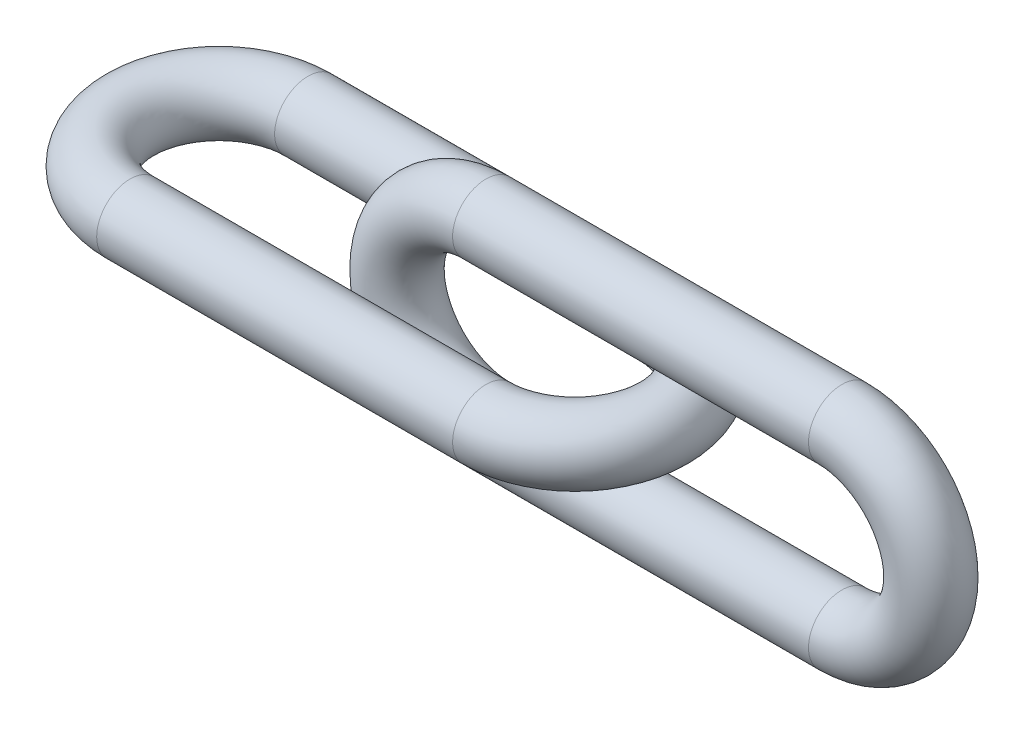
ISO-10303-21;
HEADER;
FILE_DESCRIPTION(('STEP AP214'),'2;1');
FILE_NAME('part.step','',(''),(''),'','','');
FILE_SCHEMA(('AUTOMOTIVE_DESIGN { 1 0 10303 214 1 1 1 1 }'));
ENDSEC;
DATA;
#1=APPLICATION_CONTEXT('core data for automotive mechanical design processes');
#2=APPLICATION_PROTOCOL_DEFINITION('international standard','automotive_design',2000,#1);
#3=PRODUCT_CONTEXT('',#1,'mechanical');
#4=PRODUCT('Part','Part','',(#3));
#5=PRODUCT_RELATED_PRODUCT_CATEGORY('part','',(#4));
#6=PRODUCT_DEFINITION_FORMATION('','',#4);
#7=PRODUCT_DEFINITION_CONTEXT('part definition',#1,'design');
#8=PRODUCT_DEFINITION('design','',#6,#7);
#9=PRODUCT_DEFINITION_SHAPE('','',#8);
#10=(LENGTH_UNIT() NAMED_UNIT(*) SI_UNIT(.MILLI.,.METRE.));
#11=(NAMED_UNIT(*) PLANE_ANGLE_UNIT() SI_UNIT($,.RADIAN.));
#12=(NAMED_UNIT(*) SI_UNIT($,.STERADIAN.) SOLID_ANGLE_UNIT());
#13=UNCERTAINTY_MEASURE_WITH_UNIT(LENGTH_MEASURE(1.E-05),#10,'distance_accuracy_value','');
#14=(GEOMETRIC_REPRESENTATION_CONTEXT(3) GLOBAL_UNCERTAINTY_ASSIGNED_CONTEXT((#13)) GLOBAL_UNIT_ASSIGNED_CONTEXT((#10,
#11,#12)) REPRESENTATION_CONTEXT('',''));
#15=CARTESIAN_POINT('',(0.,0.,0.));
#16=DIRECTION('',(0.,0.,1.));
#17=DIRECTION('',(1.,0.,0.));
#18=AXIS2_PLACEMENT_3D('',#15,#16,#17);
#19=CARTESIAN_POINT('',(10.,0.,0.));
#20=DIRECTION('',(0.,-1.,0.));
#21=DIRECTION('',(0.,0.,-1.));
#22=AXIS2_PLACEMENT_3D('',#19,#20,#21);
#23=TOROIDAL_SURFACE('',#22,10.,3.75);
#24=CARTESIAN_POINT('',(9.99999999999999,0.,-10.));
#25=DIRECTION('',(-1.,0.,0.));
#26=DIRECTION('',(0.,0.,1.));
#27=AXIS2_PLACEMENT_3D('',#24,#25,#26);
#28=CIRCLE('',#27,3.75);
#29=CARTESIAN_POINT('',(9.99999999999998,0.,-13.75));
#30=VERTEX_POINT('',#29);
#31=EDGE_CURVE('E93',#30,#30,#28,.T.);
#32=CARTESIAN_POINT('',(10.,0.,10.));
#33=DIRECTION('',(1.,0.,0.));
#34=DIRECTION('',(0.,0.,-1.));
#35=AXIS2_PLACEMENT_3D('',#32,#33,#34);
#36=CIRCLE('',#35,3.75);
#37=CARTESIAN_POINT('',(10.,0.,13.75));
#38=VERTEX_POINT('',#37);
#39=EDGE_CURVE('E88',#38,#38,#36,.T.);
#40=CARTESIAN_POINT('',(10.,0.,0.));
#41=DIRECTION('',(0.,-1.,0.));
#42=DIRECTION('',(0.,0.,-1.));
#43=AXIS2_PLACEMENT_3D('',#40,#41,#42);
#44=CIRCLE('',#43,13.75);
#45=EDGE_CURVE('',#30,#38,#44,.T.);
#46=ORIENTED_EDGE('',*,*,#31,.F.);
#47=ORIENTED_EDGE('',*,*,#39,.T.);
#48=ORIENTED_EDGE('',*,*,#45,.T.);
#49=ORIENTED_EDGE('',*,*,#45,.F.);
#50=EDGE_LOOP('',(#46,#48,#47,#49));
#51=FACE_BOUND('',#50,.T.);
#52=ADVANCED_FACE('F75',(#51),#23,.T.);
#53=CARTESIAN_POINT('',(10.,0.,10.));
#54=DIRECTION('',(-1.,0.,0.));
#55=DIRECTION('',(0.,0.,1.));
#56=AXIS2_PLACEMENT_3D('',#53,#54,#55);
#57=CYLINDRICAL_SURFACE('',#56,3.75);
#58=CARTESIAN_POINT('',(-30.,0.,10.));
#59=DIRECTION('',(1.,0.,0.));
#60=DIRECTION('',(0.,0.,-1.));
#61=AXIS2_PLACEMENT_3D('',#58,#59,#60);
#62=CIRCLE('',#61,3.75);
#63=CARTESIAN_POINT('',(-30.,0.,13.75));
#64=VERTEX_POINT('',#63);
#65=EDGE_CURVE('E83',#64,#64,#62,.T.);
#66=ORIENTED_EDGE('',*,*,#65,.T.);
#67=EDGE_LOOP('',(#66));
#68=FACE_BOUND('',#67,.T.);
#69=ORIENTED_EDGE('',*,*,#39,.F.);
#70=EDGE_LOOP('',(#69));
#71=FACE_BOUND('',#70,.T.);
#72=ADVANCED_FACE('F103',(#68,#71),#57,.T.);
#73=CARTESIAN_POINT('',(-30.,0.,0.));
#74=DIRECTION('',(0.,-1.,0.));
#75=DIRECTION('',(0.,0.,-1.));
#76=AXIS2_PLACEMENT_3D('',#73,#74,#75);
#77=TOROIDAL_SURFACE('',#76,10.,3.75);
#78=CARTESIAN_POINT('',(-30.,0.,-10.));
#79=DIRECTION('',(-1.,0.,0.));
#80=DIRECTION('',(0.,0.,1.));
#81=AXIS2_PLACEMENT_3D('',#78,#79,#80);
#82=CIRCLE('',#81,3.75);
#83=CARTESIAN_POINT('',(-30.,0.,-13.75));
#84=VERTEX_POINT('',#83);
#85=EDGE_CURVE('E12',#84,#84,#82,.T.);
#86=CARTESIAN_POINT('',(-30.,0.,0.));
#87=DIRECTION('',(0.,-1.,0.));
#88=DIRECTION('',(0.,0.,-1.));
#89=AXIS2_PLACEMENT_3D('',#86,#87,#88);
#90=CIRCLE('',#89,13.75);
#91=EDGE_CURVE('',#64,#84,#90,.T.);
#92=ORIENTED_EDGE('',*,*,#65,.F.);
#93=ORIENTED_EDGE('',*,*,#85,.T.);
#94=ORIENTED_EDGE('',*,*,#91,.T.);
#95=ORIENTED_EDGE('',*,*,#91,.F.);
#96=EDGE_LOOP('',(#92,#94,#93,#95));
#97=FACE_BOUND('',#96,.T.);
#98=ADVANCED_FACE('F109',(#97),#77,.T.);
#99=CARTESIAN_POINT('',(-30.,0.,-10.));
#100=DIRECTION('',(1.,0.,0.));
#101=DIRECTION('',(0.,0.,-1.));
#102=AXIS2_PLACEMENT_3D('',#99,#100,#101);
#103=CYLINDRICAL_SURFACE('',#102,3.75);
#104=ORIENTED_EDGE('',*,*,#31,.T.);
#105=EDGE_LOOP('',(#104));
#106=FACE_BOUND('',#105,.T.);
#107=ORIENTED_EDGE('',*,*,#85,.F.);
#108=EDGE_LOOP('',(#107));
#109=FACE_BOUND('',#108,.T.);
#110=ADVANCED_FACE('F77',(#106,#109),#103,.T.);
#111=CLOSED_SHELL('',(#52,#72,#98,#110));
#112=MANIFOLD_SOLID_BREP('B2',#111);
#113=CARTESIAN_POINT('',(40.,0.,0.));
#114=DIRECTION('',(0.,0.,-1.));
#115=DIRECTION('',(-1.,0.,0.));
#116=AXIS2_PLACEMENT_3D('',#113,#114,#115);
#117=TOROIDAL_SURFACE('',#116,10.,3.75);
#118=CARTESIAN_POINT('',(40.,10.,0.));
#119=DIRECTION('',(-1.,0.,0.));
#120=DIRECTION('',(0.,-1.,0.));
#121=AXIS2_PLACEMENT_3D('',#118,#119,#120);
#122=CIRCLE('',#121,3.75);
#123=CARTESIAN_POINT('',(40.,13.75,0.));
#124=VERTEX_POINT('',#123);
#125=EDGE_CURVE('E156',#124,#124,#122,.T.);
#126=CARTESIAN_POINT('',(40.,-10.,0.));
#127=DIRECTION('',(1.,0.,0.));
#128=DIRECTION('',(0.,1.,0.));
#129=AXIS2_PLACEMENT_3D('',#126,#127,#128);
#130=CIRCLE('',#129,3.75);
#131=CARTESIAN_POINT('',(40.,-13.75,0.));
#132=VERTEX_POINT('',#131);
#133=EDGE_CURVE('E152',#132,#132,#130,.T.);
#134=CARTESIAN_POINT('',(40.,0.,0.));
#135=DIRECTION('',(0.,0.,-1.));
#136=DIRECTION('',(-1.,0.,0.));
#137=AXIS2_PLACEMENT_3D('',#134,#135,#136);
#138=CIRCLE('',#137,13.75);
#139=EDGE_CURVE('',#124,#132,#138,.T.);
#140=ORIENTED_EDGE('',*,*,#125,.F.);
#141=ORIENTED_EDGE('',*,*,#133,.T.);
#142=ORIENTED_EDGE('',*,*,#139,.T.);
#143=ORIENTED_EDGE('',*,*,#139,.F.);
#144=EDGE_LOOP('',(#140,#142,#141,#143));
#145=FACE_BOUND('',#144,.T.);
#146=ADVANCED_FACE('F141',(#145),#117,.T.);
#147=CARTESIAN_POINT('',(40.,-10.,0.));
#148=DIRECTION('',(-1.,0.,0.));
#149=DIRECTION('',(0.,0.,1.));
#150=AXIS2_PLACEMENT_3D('',#147,#148,#149);
#151=CYLINDRICAL_SURFACE('',#150,3.75);
#152=CARTESIAN_POINT('',(0.,-10.,0.));
#153=DIRECTION('',(1.,0.,0.));
#154=DIRECTION('',(0.,1.,0.));
#155=AXIS2_PLACEMENT_3D('',#152,#153,#154);
#156=CIRCLE('',#155,3.75);
#157=CARTESIAN_POINT('',(0.,-13.75,0.));
#158=VERTEX_POINT('',#157);
#159=EDGE_CURVE('E148',#158,#158,#156,.T.);
#160=ORIENTED_EDGE('',*,*,#159,.T.);
#161=EDGE_LOOP('',(#160));
#162=FACE_BOUND('',#161,.T.);
#163=ORIENTED_EDGE('',*,*,#133,.F.);
#164=EDGE_LOOP('',(#163));
#165=FACE_BOUND('',#164,.T.);
#166=ADVANCED_FACE('F165',(#162,#165),#151,.T.);
#167=CARTESIAN_POINT('',(0.,0.,0.));
#168=DIRECTION('',(0.,0.,-1.));
#169=DIRECTION('',(-1.,0.,0.));
#170=AXIS2_PLACEMENT_3D('',#167,#168,#169);
#171=TOROIDAL_SURFACE('',#170,10.,3.75);
#172=CARTESIAN_POINT('',(0.,9.99999999999999,0.));
#173=DIRECTION('',(-1.,0.,0.));
#174=DIRECTION('',(0.,-1.,0.));
#175=AXIS2_PLACEMENT_3D('',#172,#173,#174);
#176=CIRCLE('',#175,3.75);
#177=CARTESIAN_POINT('',(0.,13.75,0.));
#178=VERTEX_POINT('',#177);
#179=EDGE_CURVE('E74',#178,#178,#176,.T.);
#180=CARTESIAN_POINT('',(0.,0.,0.));
#181=DIRECTION('',(0.,0.,-1.));
#182=DIRECTION('',(-1.,0.,0.));
#183=AXIS2_PLACEMENT_3D('',#180,#181,#182);
#184=CIRCLE('',#183,13.75);
#185=EDGE_CURVE('',#158,#178,#184,.T.);
#186=ORIENTED_EDGE('',*,*,#159,.F.);
#187=ORIENTED_EDGE('',*,*,#179,.T.);
#188=ORIENTED_EDGE('',*,*,#185,.T.);
#189=ORIENTED_EDGE('',*,*,#185,.F.);
#190=EDGE_LOOP('',(#186,#188,#187,#189));
#191=FACE_BOUND('',#190,.T.);
#192=ADVANCED_FACE('F171',(#191),#171,.T.);
#193=CARTESIAN_POINT('',(0.,10.,0.));
#194=DIRECTION('',(1.,0.,0.));
#195=DIRECTION('',(0.,0.,-1.));
#196=AXIS2_PLACEMENT_3D('',#193,#194,#195);
#197=CYLINDRICAL_SURFACE('',#196,3.75);
#198=ORIENTED_EDGE('',*,*,#125,.T.);
#199=EDGE_LOOP('',(#198));
#200=FACE_BOUND('',#199,.T.);
#201=ORIENTED_EDGE('',*,*,#179,.F.);
#202=EDGE_LOOP('',(#201));
#203=FACE_BOUND('',#202,.T.);
#204=ADVANCED_FACE('F143',(#200,#203),#197,.T.);
#205=CLOSED_SHELL('',(#146,#166,#192,#204));
#206=MANIFOLD_SOLID_BREP('B7',#205);
#207=ADVANCED_BREP_SHAPE_REPRESENTATION('',(#18,#112,#206),#14);
#208=SHAPE_DEFINITION_REPRESENTATION(#9,#207);
ENDSEC;
END-ISO-10303-21;
